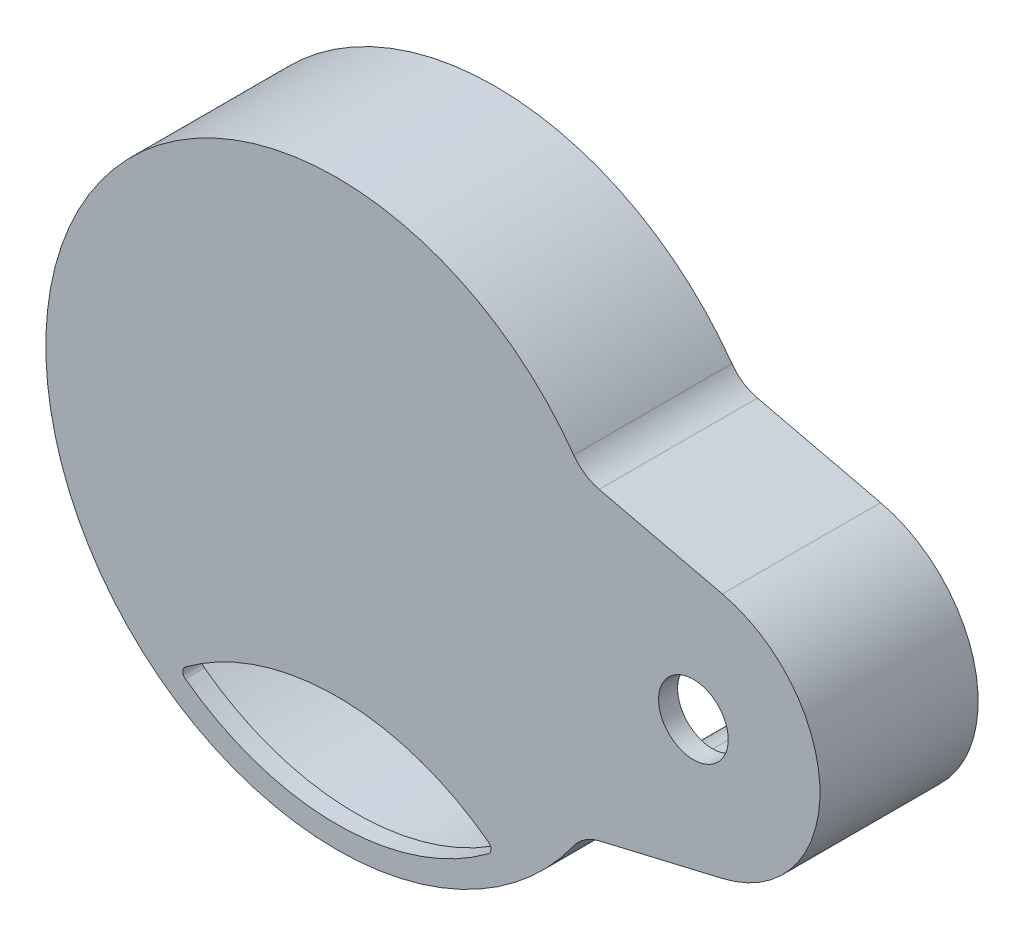
ISO-10303-21;
HEADER;
FILE_DESCRIPTION(('STEP AP214'),'2;1');
FILE_NAME('part.step','',(''),(''),'','','');
FILE_SCHEMA(('AUTOMOTIVE_DESIGN { 1 0 10303 214 1 1 1 1 }'));
ENDSEC;
DATA;
#1=APPLICATION_CONTEXT('core data for automotive mechanical design processes');
#2=APPLICATION_PROTOCOL_DEFINITION('international standard','automotive_design',2000,#1);
#3=PRODUCT_CONTEXT('',#1,'mechanical');
#4=PRODUCT('Part','Part','',(#3));
#5=PRODUCT_RELATED_PRODUCT_CATEGORY('part','',(#4));
#6=PRODUCT_DEFINITION_FORMATION('','',#4);
#7=PRODUCT_DEFINITION_CONTEXT('part definition',#1,'design');
#8=PRODUCT_DEFINITION('design','',#6,#7);
#9=PRODUCT_DEFINITION_SHAPE('','',#8);
#10=(LENGTH_UNIT() NAMED_UNIT(*) SI_UNIT(.MILLI.,.METRE.));
#11=(NAMED_UNIT(*) PLANE_ANGLE_UNIT() SI_UNIT($,.RADIAN.));
#12=(NAMED_UNIT(*) SI_UNIT($,.STERADIAN.) SOLID_ANGLE_UNIT());
#13=UNCERTAINTY_MEASURE_WITH_UNIT(LENGTH_MEASURE(1.E-05),#10,'distance_accuracy_value','');
#14=(GEOMETRIC_REPRESENTATION_CONTEXT(3) GLOBAL_UNCERTAINTY_ASSIGNED_CONTEXT((#13)) GLOBAL_UNIT_ASSIGNED_CONTEXT((#10,
#11,#12)) REPRESENTATION_CONTEXT('',''));
#15=CARTESIAN_POINT('',(0.,0.,0.));
#16=DIRECTION('',(0.,0.,1.));
#17=DIRECTION('',(1.,0.,0.));
#18=AXIS2_PLACEMENT_3D('',#15,#16,#17);
#19=CARTESIAN_POINT('',(43.0203044332523,30.7413410321939,25.));
#20=DIRECTION('',(0.,0.,-1.));
#21=DIRECTION('',(-1.,0.,0.));
#22=AXIS2_PLACEMENT_3D('',#19,#20,#21);
#23=CYLINDRICAL_SURFACE('',#22,9.87510417944691);
#24=DIRECTION('',(0.,0.,-1.));
#25=VECTOR('',#24,1.);
#26=CARTESIAN_POINT('',(40.7586135093194,21.1287224129244,25.));
#27=LINE('',#26,#25);
#28=CARTESIAN_POINT('',(40.7586135093194,21.1287224129244,22.));
#29=VERTEX_POINT('',#28);
#30=CARTESIAN_POINT('',(40.7586135093194,21.1287224129244,0.));
#31=VERTEX_POINT('',#30);
#32=EDGE_CURVE('E253',#29,#31,#27,.T.);
#33=ORIENTED_EDGE('',*,*,#32,.F.);
#34=CARTESIAN_POINT('',(43.0203044332523,30.7413410321939,22.));
#35=DIRECTION('',(0.,0.,1.));
#36=DIRECTION('',(1.,0.,0.));
#37=AXIS2_PLACEMENT_3D('',#34,#35,#36);
#38=CIRCLE('',#37,9.87510417944691);
#39=CARTESIAN_POINT('',(34.9857116171821,24.9999996527874,22.));
#40=VERTEX_POINT('',#39);
#41=EDGE_CURVE('E225',#29,#40,#38,.F.);
#42=ORIENTED_EDGE('',*,*,#41,.T.);
#43=DIRECTION('',(0.,0.,-1.));
#44=VECTOR('',#43,1.);
#45=CARTESIAN_POINT('',(34.9857116171821,24.9999996527874,25.));
#46=LINE('',#45,#44);
#47=CARTESIAN_POINT('',(34.9857116171821,24.9999996527874,0.));
#48=VERTEX_POINT('',#47);
#49=EDGE_CURVE('E268',#40,#48,#46,.T.);
#50=ORIENTED_EDGE('',*,*,#49,.T.);
#51=CARTESIAN_POINT('',(43.0203044332523,30.7413410321939,0.));
#52=DIRECTION('',(0.,0.,-1.));
#53=DIRECTION('',(1.,0.,0.));
#54=AXIS2_PLACEMENT_3D('',#51,#52,#53);
#55=CIRCLE('',#54,9.87510417944691);
#56=EDGE_CURVE('E229',#31,#48,#55,.T.);
#57=ORIENTED_EDGE('',*,*,#56,.F.);
#58=EDGE_LOOP('',(#33,#42,#50,#57));
#59=FACE_BOUND('',#58,.T.);
#60=ADVANCED_FACE('F43',(#59),#23,.T.);
#61=CARTESIAN_POINT('',(0.,0.,25.));
#62=DIRECTION('',(0.,0.,-1.));
#63=DIRECTION('',(-1.,0.,0.));
#64=AXIS2_PLACEMENT_3D('',#61,#62,#63);
#65=CYLINDRICAL_SURFACE('',#64,43.);
#66=ORIENTED_EDGE('',*,*,#49,.F.);
#67=CARTESIAN_POINT('',(0.,0.,22.));
#68=DIRECTION('',(0.,0.,1.));
#69=DIRECTION('',(1.,0.,0.));
#70=AXIS2_PLACEMENT_3D('',#67,#68,#69);
#71=CIRCLE('',#70,43.);
#72=CARTESIAN_POINT('',(34.9857111209615,-25.0000003472127,22.));
#73=VERTEX_POINT('',#72);
#74=EDGE_CURVE('E221',#40,#73,#71,.T.);
#75=ORIENTED_EDGE('',*,*,#74,.T.);
#76=DIRECTION('',(0.,0.,-1.));
#77=VECTOR('',#76,1.);
#78=CARTESIAN_POINT('',(34.9857111209615,-25.0000003472127,25.));
#79=LINE('',#78,#77);
#80=CARTESIAN_POINT('',(34.9857111209615,-25.0000003472127,0.));
#81=VERTEX_POINT('',#80);
#82=EDGE_CURVE('E265',#73,#81,#79,.T.);
#83=ORIENTED_EDGE('',*,*,#82,.T.);
#84=CARTESIAN_POINT('',(0.,0.,0.));
#85=DIRECTION('',(0.,0.,1.));
#86=DIRECTION('',(1.,0.,0.));
#87=AXIS2_PLACEMENT_3D('',#84,#85,#86);
#88=CIRCLE('',#87,43.);
#89=EDGE_CURVE('E233',#48,#81,#88,.T.);
#90=ORIENTED_EDGE('',*,*,#89,.F.);
#91=EDGE_LOOP('',(#66,#75,#83,#90));
#92=FACE_BOUND('',#91,.T.);
#93=ADVANCED_FACE('F378',(#92),#65,.F.);
#94=CARTESIAN_POINT('',(43.0203044332523,-30.7413410321939,25.));
#95=DIRECTION('',(0.,0.,-1.));
#96=DIRECTION('',(-1.,0.,0.));
#97=AXIS2_PLACEMENT_3D('',#94,#95,#96);
#98=CYLINDRICAL_SURFACE('',#97,9.87510417944684);
#99=ORIENTED_EDGE('',*,*,#82,.F.);
#100=CARTESIAN_POINT('',(43.0203044332523,-30.7413410321939,22.));
#101=DIRECTION('',(0.,0.,1.));
#102=DIRECTION('',(1.,0.,0.));
#103=AXIS2_PLACEMENT_3D('',#100,#101,#102);
#104=CIRCLE('',#103,9.87510417944684);
#105=CARTESIAN_POINT('',(40.7586135093194,-21.1287224129244,22.));
#106=VERTEX_POINT('',#105);
#107=EDGE_CURVE('E217',#73,#106,#104,.F.);
#108=ORIENTED_EDGE('',*,*,#107,.T.);
#109=DIRECTION('',(0.,0.,-1.));
#110=VECTOR('',#109,1.);
#111=CARTESIAN_POINT('',(40.7586135093194,-21.1287224129244,25.));
#112=LINE('',#111,#110);
#113=CARTESIAN_POINT('',(40.7586135093194,-21.1287224129244,0.));
#114=VERTEX_POINT('',#113);
#115=EDGE_CURVE('E262',#106,#114,#112,.T.);
#116=ORIENTED_EDGE('',*,*,#115,.T.);
#117=CARTESIAN_POINT('',(43.0203044332523,-30.7413410321939,0.));
#118=DIRECTION('',(0.,0.,-1.));
#119=DIRECTION('',(1.,0.,0.));
#120=AXIS2_PLACEMENT_3D('',#117,#118,#119);
#121=CIRCLE('',#120,9.87510417944684);
#122=EDGE_CURVE('E237',#81,#114,#121,.T.);
#123=ORIENTED_EDGE('',*,*,#122,.F.);
#124=EDGE_LOOP('',(#99,#108,#116,#123));
#125=FACE_BOUND('',#124,.T.);
#126=ADVANCED_FACE('F383',(#125),#98,.T.);
#127=CARTESIAN_POINT('',(60.2270027933056,-16.5481308913883,25.));
#128=DIRECTION('',(-0.229029576076803,0.973419464199314,0.));
#129=DIRECTION('',(-0.973419464199314,-0.229029576076803,0.));
#130=AXIS2_PLACEMENT_3D('',#127,#128,#129);
#131=PLANE('',#130);
#132=ORIENTED_EDGE('',*,*,#115,.F.);
#133=DIRECTION('',(0.973419464199314,0.229029576076803,0.));
#134=VECTOR('',#133,1.);
#135=CARTESIAN_POINT('',(60.2270027933056,-16.5481308913883,22.));
#136=LINE('',#135,#134);
#137=CARTESIAN_POINT('',(60.2270027933056,-16.5481308913883,22.));
#138=VERTEX_POINT('',#137);
#139=EDGE_CURVE('E213',#106,#138,#136,.T.);
#140=ORIENTED_EDGE('',*,*,#139,.T.);
#141=DIRECTION('',(0.,0.,-1.));
#142=VECTOR('',#141,1.);
#143=CARTESIAN_POINT('',(60.2270027933056,-16.5481308913883,25.));
#144=LINE('',#143,#142);
#145=CARTESIAN_POINT('',(60.2270027933056,-16.5481308913883,0.));
#146=VERTEX_POINT('',#145);
#147=EDGE_CURVE('E259',#138,#146,#144,.T.);
#148=ORIENTED_EDGE('',*,*,#147,.T.);
#149=DIRECTION('',(0.973419464199314,0.229029576076803,0.));
#150=VECTOR('',#149,1.);
#151=CARTESIAN_POINT('',(60.2270027933056,-16.5481308913883,0.));
#152=LINE('',#151,#150);
#153=EDGE_CURVE('E241',#114,#146,#152,.T.);
#154=ORIENTED_EDGE('',*,*,#153,.F.);
#155=EDGE_LOOP('',(#132,#140,#148,#154));
#156=FACE_BOUND('',#155,.T.);
#157=ADVANCED_FACE('F390',(#156),#131,.T.);
#158=CARTESIAN_POINT('',(56.3335,0.,25.));
#159=DIRECTION('',(0.,0.,-1.));
#160=DIRECTION('',(-1.,0.,0.));
#161=AXIS2_PLACEMENT_3D('',#158,#159,#160);
#162=CYLINDRICAL_SURFACE('',#161,17.);
#163=ORIENTED_EDGE('',*,*,#147,.F.);
#164=CARTESIAN_POINT('',(56.3335,0.,22.));
#165=DIRECTION('',(0.,0.,1.));
#166=DIRECTION('',(1.,0.,0.));
#167=AXIS2_PLACEMENT_3D('',#164,#165,#166);
#168=CIRCLE('',#167,17.);
#169=CARTESIAN_POINT('',(60.2270027933056,16.5481308913883,22.));
#170=VERTEX_POINT('',#169);
#171=EDGE_CURVE('E204',#138,#170,#168,.T.);
#172=ORIENTED_EDGE('',*,*,#171,.T.);
#173=DIRECTION('',(0.,0.,-1.));
#174=VECTOR('',#173,1.);
#175=CARTESIAN_POINT('',(60.2270027933056,16.5481308913883,25.));
#176=LINE('',#175,#174);
#177=CARTESIAN_POINT('',(60.2270027933056,16.5481308913883,0.));
#178=VERTEX_POINT('',#177);
#179=EDGE_CURVE('E256',#170,#178,#176,.T.);
#180=ORIENTED_EDGE('',*,*,#179,.T.);
#181=CARTESIAN_POINT('',(56.3335,0.,0.));
#182=DIRECTION('',(0.,0.,1.));
#183=DIRECTION('',(-1.,0.,0.));
#184=AXIS2_PLACEMENT_3D('',#181,#182,#183);
#185=CIRCLE('',#184,17.);
#186=EDGE_CURVE('E245',#146,#178,#185,.T.);
#187=ORIENTED_EDGE('',*,*,#186,.F.);
#188=EDGE_LOOP('',(#163,#172,#180,#187));
#189=FACE_BOUND('',#188,.T.);
#190=ADVANCED_FACE('F371',(#189),#162,.F.);
#191=CARTESIAN_POINT('',(40.7586135093194,21.1287224129244,25.));
#192=DIRECTION('',(-0.229029576076803,-0.973419464199314,0.));
#193=DIRECTION('',(0.973419464199314,-0.229029576076803,0.));
#194=AXIS2_PLACEMENT_3D('',#191,#192,#193);
#195=PLANE('',#194);
#196=ORIENTED_EDGE('',*,*,#179,.F.);
#197=DIRECTION('',(-0.973419464199314,0.229029576076803,0.));
#198=VECTOR('',#197,1.);
#199=CARTESIAN_POINT('',(40.7586135093194,21.1287224129244,22.));
#200=LINE('',#199,#198);
#201=EDGE_CURVE('E11',#170,#29,#200,.T.);
#202=ORIENTED_EDGE('',*,*,#201,.T.);
#203=ORIENTED_EDGE('',*,*,#32,.T.);
#204=DIRECTION('',(-0.973419464199314,0.229029576076803,0.));
#205=VECTOR('',#204,1.);
#206=CARTESIAN_POINT('',(40.7586135093194,21.1287224129244,0.));
#207=LINE('',#206,#205);
#208=EDGE_CURVE('E249',#178,#31,#207,.T.);
#209=ORIENTED_EDGE('',*,*,#208,.F.);
#210=EDGE_LOOP('',(#196,#202,#203,#209));
#211=FACE_BOUND('',#210,.T.);
#212=ADVANCED_FACE('F363',(#211),#195,.T.);
#213=CARTESIAN_POINT('',(43.0203044332523,-30.7413410321939,25.));
#214=DIRECTION('',(0.,0.,1.));
#215=DIRECTION('',(1.,0.,0.));
#216=AXIS2_PLACEMENT_3D('',#213,#214,#215);
#217=PLANE('',#216);
#218=CARTESIAN_POINT('',(56.3335,0.,25.));
#219=DIRECTION('',(0.,0.,1.));
#220=DIRECTION('',(1.,0.,0.));
#221=AXIS2_PLACEMENT_3D('',#218,#219,#220);
#222=CIRCLE('',#221,5.5);
#223=CARTESIAN_POINT('',(61.8335,0.,25.));
#224=VERTEX_POINT('',#223);
#225=EDGE_CURVE('E185',#224,#224,#222,.T.);
#226=ORIENTED_EDGE('',*,*,#225,.F.);
#227=EDGE_LOOP('',(#226));
#228=FACE_BOUND('',#227,.T.);
#229=CARTESIAN_POINT('',(0.,-2.52363009905265,25.));
#230=DIRECTION('',(0.,0.,1.));
#231=DIRECTION('',(-1.,0.,0.));
#232=AXIS2_PLACEMENT_3D('',#229,#230,#231);
#233=CIRCLE('',#232,40.);
#234=CARTESIAN_POINT('',(-23.9476923076923,-34.5627941508205,25.));
#235=VERTEX_POINT('',#234);
#236=CARTESIAN_POINT('',(23.9476923076923,-34.5627941508205,25.));
#237=VERTEX_POINT('',#236);
#238=EDGE_CURVE('E59',#235,#237,#233,.T.);
#239=ORIENTED_EDGE('',*,*,#238,.F.);
#240=CARTESIAN_POINT('',(-23.349,-33.7618150495263,25.));
#241=DIRECTION('',(0.,0.,1.));
#242=DIRECTION('',(-1.,0.,0.));
#243=AXIS2_PLACEMENT_3D('',#240,#241,#242);
#244=CIRCLE('',#243,0.999999999999999);
#245=CARTESIAN_POINT('',(-23.9476923076923,-32.9608359482321,25.));
#246=VERTEX_POINT('',#245);
#247=EDGE_CURVE('E178',#246,#235,#244,.T.);
#248=ORIENTED_EDGE('',*,*,#247,.F.);
#249=CARTESIAN_POINT('',(0.,-65.,25.));
#250=DIRECTION('',(0.,0.,1.));
#251=DIRECTION('',(-1.,0.,0.));
#252=AXIS2_PLACEMENT_3D('',#249,#250,#251);
#253=CIRCLE('',#252,40.);
#254=CARTESIAN_POINT('',(23.9476923076923,-32.9608359482321,25.));
#255=VERTEX_POINT('',#254);
#256=EDGE_CURVE('E182',#255,#246,#253,.T.);
#257=ORIENTED_EDGE('',*,*,#256,.F.);
#258=CARTESIAN_POINT('',(23.349,-33.7618150495263,25.));
#259=DIRECTION('',(0.,0.,1.));
#260=DIRECTION('',(-1.,0.,0.));
#261=AXIS2_PLACEMENT_3D('',#258,#259,#260);
#262=CIRCLE('',#261,0.999999999999999);
#263=EDGE_CURVE('E194',#237,#255,#262,.T.);
#264=ORIENTED_EDGE('',*,*,#263,.F.);
#265=EDGE_LOOP('',(#239,#248,#257,#264));
#266=FACE_BOUND('',#265,.T.);
#267=CARTESIAN_POINT('',(43.0203044332523,-30.7413410321939,25.));
#268=DIRECTION('',(0.,0.,-1.));
#269=DIRECTION('',(1.,0.,0.));
#270=AXIS2_PLACEMENT_3D('',#267,#268,#269);
#271=CIRCLE('',#270,6.87510417944683);
#272=CARTESIAN_POINT('',(37.4265744778301,-26.7441867114228,25.));
#273=VERTEX_POINT('',#272);
#274=CARTESIAN_POINT('',(41.4457022375498,-24.0489808055223,25.));
#275=VERTEX_POINT('',#274);
#276=EDGE_CURVE('E272',#273,#275,#271,.T.);
#277=ORIENTED_EDGE('',*,*,#276,.T.);
#278=DIRECTION('',(0.973419464199314,0.229029576076803,0.));
#279=VECTOR('',#278,1.);
#280=CARTESIAN_POINT('',(60.914091521536,-19.4683892839863,25.));
#281=LINE('',#280,#279);
#282=CARTESIAN_POINT('',(60.9140915215361,-19.4683892839863,25.));
#283=VERTEX_POINT('',#282);
#284=EDGE_CURVE('E276',#275,#283,#281,.T.);
#285=ORIENTED_EDGE('',*,*,#284,.T.);
#286=CARTESIAN_POINT('',(56.3335,0.,25.));
#287=DIRECTION('',(0.,0.,1.));
#288=DIRECTION('',(-1.,0.,0.));
#289=AXIS2_PLACEMENT_3D('',#286,#287,#288);
#290=CIRCLE('',#289,20.);
#291=CARTESIAN_POINT('',(60.9140915215361,19.4683892839863,25.));
#292=VERTEX_POINT('',#291);
#293=EDGE_CURVE('E280',#283,#292,#290,.T.);
#294=ORIENTED_EDGE('',*,*,#293,.T.);
#295=DIRECTION('',(-0.973419464199314,0.229029576076803,0.));
#296=VECTOR('',#295,1.);
#297=CARTESIAN_POINT('',(41.4457022375498,24.0489808055223,25.));
#298=LINE('',#297,#296);
#299=CARTESIAN_POINT('',(41.4457022375498,24.0489808055223,25.));
#300=VERTEX_POINT('',#299);
#301=EDGE_CURVE('E283',#292,#300,#298,.T.);
#302=ORIENTED_EDGE('',*,*,#301,.T.);
#303=CARTESIAN_POINT('',(43.0203044332523,30.7413410321939,25.));
#304=DIRECTION('',(0.,0.,-1.));
#305=DIRECTION('',(1.,0.,0.));
#306=AXIS2_PLACEMENT_3D('',#303,#304,#305);
#307=CIRCLE('',#306,6.8751041794468);
#308=CARTESIAN_POINT('',(37.4265748233019,26.7441862279598,25.));
#309=VERTEX_POINT('',#308);
#310=EDGE_CURVE('E286',#300,#309,#307,.T.);
#311=ORIENTED_EDGE('',*,*,#310,.T.);
#312=CARTESIAN_POINT('',(0.,0.,25.));
#313=DIRECTION('',(0.,0.,1.));
#314=DIRECTION('',(1.,0.,0.));
#315=AXIS2_PLACEMENT_3D('',#312,#313,#314);
#316=CIRCLE('',#315,46.0000000000001);
#317=EDGE_CURVE('E289',#309,#273,#316,.T.);
#318=ORIENTED_EDGE('',*,*,#317,.T.);
#319=EDGE_LOOP('',(#277,#285,#294,#302,#311,#318));
#320=FACE_BOUND('',#319,.T.);
#321=ADVANCED_FACE('F361',(#228,#266,#320),#217,.T.);
#322=CARTESIAN_POINT('',(43.0203044332523,-30.7413410321939,0.));
#323=DIRECTION('',(0.,0.,1.));
#324=DIRECTION('',(1.,0.,0.));
#325=AXIS2_PLACEMENT_3D('',#322,#323,#324);
#326=PLANE('',#325);
#327=CARTESIAN_POINT('',(43.0203044332523,-30.7413410321939,0.));
#328=DIRECTION('',(0.,0.,-1.));
#329=DIRECTION('',(1.,0.,0.));
#330=AXIS2_PLACEMENT_3D('',#327,#328,#329);
#331=CIRCLE('',#330,6.87510417944683);
#332=CARTESIAN_POINT('',(37.4265744778301,-26.7441867114228,0.));
#333=VERTEX_POINT('',#332);
#334=CARTESIAN_POINT('',(41.4457022375498,-24.0489808055223,0.));
#335=VERTEX_POINT('',#334);
#336=EDGE_CURVE('E271',#333,#335,#331,.T.);
#337=ORIENTED_EDGE('',*,*,#336,.F.);
#338=CARTESIAN_POINT('',(0.,0.,0.));
#339=DIRECTION('',(0.,0.,1.));
#340=DIRECTION('',(1.,0.,0.));
#341=AXIS2_PLACEMENT_3D('',#338,#339,#340);
#342=CIRCLE('',#341,46.0000000000001);
#343=CARTESIAN_POINT('',(37.4265748233019,26.7441862279598,0.));
#344=VERTEX_POINT('',#343);
#345=EDGE_CURVE('E277',#344,#333,#342,.T.);
#346=ORIENTED_EDGE('',*,*,#345,.F.);
#347=CARTESIAN_POINT('',(43.0203044332523,30.7413410321939,0.));
#348=DIRECTION('',(0.,0.,-1.));
#349=DIRECTION('',(1.,0.,0.));
#350=AXIS2_PLACEMENT_3D('',#347,#348,#349);
#351=CIRCLE('',#350,6.8751041794468);
#352=CARTESIAN_POINT('',(41.4457022375498,24.0489808055223,0.));
#353=VERTEX_POINT('',#352);
#354=EDGE_CURVE('E308',#353,#344,#351,.T.);
#355=ORIENTED_EDGE('',*,*,#354,.F.);
#356=DIRECTION('',(-0.973419464199314,0.229029576076803,0.));
#357=VECTOR('',#356,1.);
#358=CARTESIAN_POINT('',(41.4457022375498,24.0489808055223,0.));
#359=LINE('',#358,#357);
#360=CARTESIAN_POINT('',(60.9140915215361,19.4683892839863,0.));
#361=VERTEX_POINT('',#360);
#362=EDGE_CURVE('E304',#361,#353,#359,.T.);
#363=ORIENTED_EDGE('',*,*,#362,.F.);
#364=CARTESIAN_POINT('',(56.3335,0.,0.));
#365=DIRECTION('',(0.,0.,1.));
#366=DIRECTION('',(-1.,0.,0.));
#367=AXIS2_PLACEMENT_3D('',#364,#365,#366);
#368=CIRCLE('',#367,20.);
#369=CARTESIAN_POINT('',(60.9140915215361,-19.4683892839863,0.));
#370=VERTEX_POINT('',#369);
#371=EDGE_CURVE('E300',#370,#361,#368,.T.);
#372=ORIENTED_EDGE('',*,*,#371,.F.);
#373=DIRECTION('',(0.973419464199314,0.229029576076803,0.));
#374=VECTOR('',#373,1.);
#375=CARTESIAN_POINT('',(60.914091521536,-19.4683892839863,0.));
#376=LINE('',#375,#374);
#377=EDGE_CURVE('E296',#335,#370,#376,.T.);
#378=ORIENTED_EDGE('',*,*,#377,.F.);
#379=EDGE_LOOP('',(#337,#346,#355,#363,#372,#378));
#380=FACE_BOUND('',#379,.T.);
#381=ORIENTED_EDGE('',*,*,#56,.T.);
#382=ORIENTED_EDGE('',*,*,#89,.T.);
#383=ORIENTED_EDGE('',*,*,#122,.T.);
#384=ORIENTED_EDGE('',*,*,#153,.T.);
#385=ORIENTED_EDGE('',*,*,#186,.T.);
#386=ORIENTED_EDGE('',*,*,#208,.T.);
#387=EDGE_LOOP('',(#381,#382,#383,#384,#385,#386));
#388=FACE_BOUND('',#387,.T.);
#389=ADVANCED_FACE('F339',(#380,#388),#326,.F.);
#390=CARTESIAN_POINT('',(43.0203044332523,-30.7413410321939,25.));
#391=DIRECTION('',(0.,0.,-1.));
#392=DIRECTION('',(-1.,0.,0.));
#393=AXIS2_PLACEMENT_3D('',#390,#391,#392);
#394=CYLINDRICAL_SURFACE('',#393,6.87510417944683);
#395=DIRECTION('',(0.,0.,-1.));
#396=VECTOR('',#395,1.);
#397=CARTESIAN_POINT('',(37.4265744778301,-26.7441867114228,25.));
#398=LINE('',#397,#396);
#399=EDGE_CURVE('E292',#273,#333,#398,.T.);
#400=ORIENTED_EDGE('',*,*,#399,.T.);
#401=ORIENTED_EDGE('',*,*,#336,.T.);
#402=DIRECTION('',(0.,0.,-1.));
#403=VECTOR('',#402,1.);
#404=CARTESIAN_POINT('',(41.4457022375498,-24.0489808055223,25.));
#405=LINE('',#404,#403);
#406=EDGE_CURVE('E52',#275,#335,#405,.T.);
#407=ORIENTED_EDGE('',*,*,#406,.F.);
#408=ORIENTED_EDGE('',*,*,#276,.F.);
#409=EDGE_LOOP('',(#400,#401,#407,#408));
#410=FACE_BOUND('',#409,.T.);
#411=ADVANCED_FACE('F45',(#410),#394,.F.);
#412=CARTESIAN_POINT('',(60.914091521536,-19.4683892839863,25.));
#413=DIRECTION('',(-0.229029576076803,0.973419464199314,0.));
#414=DIRECTION('',(-0.973419464199314,-0.229029576076803,0.));
#415=AXIS2_PLACEMENT_3D('',#412,#413,#414);
#416=PLANE('',#415);
#417=ORIENTED_EDGE('',*,*,#406,.T.);
#418=ORIENTED_EDGE('',*,*,#377,.T.);
#419=DIRECTION('',(0.,0.,-1.));
#420=VECTOR('',#419,1.);
#421=CARTESIAN_POINT('',(60.9140915215361,-19.4683892839863,25.));
#422=LINE('',#421,#420);
#423=EDGE_CURVE('E326',#283,#370,#422,.T.);
#424=ORIENTED_EDGE('',*,*,#423,.F.);
#425=ORIENTED_EDGE('',*,*,#284,.F.);
#426=EDGE_LOOP('',(#417,#418,#424,#425));
#427=FACE_BOUND('',#426,.T.);
#428=ADVANCED_FACE('F332',(#427),#416,.F.);
#429=CARTESIAN_POINT('',(56.3335,0.,25.));
#430=DIRECTION('',(0.,0.,-1.));
#431=DIRECTION('',(-1.,0.,0.));
#432=AXIS2_PLACEMENT_3D('',#429,#430,#431);
#433=CYLINDRICAL_SURFACE('',#432,20.);
#434=ORIENTED_EDGE('',*,*,#423,.T.);
#435=ORIENTED_EDGE('',*,*,#371,.T.);
#436=DIRECTION('',(0.,0.,-1.));
#437=VECTOR('',#436,1.);
#438=CARTESIAN_POINT('',(60.9140915215361,19.4683892839863,25.));
#439=LINE('',#438,#437);
#440=EDGE_CURVE('E323',#292,#361,#439,.T.);
#441=ORIENTED_EDGE('',*,*,#440,.F.);
#442=ORIENTED_EDGE('',*,*,#293,.F.);
#443=EDGE_LOOP('',(#434,#435,#441,#442));
#444=FACE_BOUND('',#443,.T.);
#445=ADVANCED_FACE('F359',(#444),#433,.T.);
#446=CARTESIAN_POINT('',(41.4457022375498,24.0489808055223,25.));
#447=DIRECTION('',(-0.229029576076803,-0.973419464199314,0.));
#448=DIRECTION('',(0.973419464199314,-0.229029576076803,0.));
#449=AXIS2_PLACEMENT_3D('',#446,#447,#448);
#450=PLANE('',#449);
#451=ORIENTED_EDGE('',*,*,#440,.T.);
#452=ORIENTED_EDGE('',*,*,#362,.T.);
#453=DIRECTION('',(0.,0.,-1.));
#454=VECTOR('',#453,1.);
#455=CARTESIAN_POINT('',(41.4457022375498,24.0489808055223,25.));
#456=LINE('',#455,#454);
#457=EDGE_CURVE('E320',#300,#353,#456,.T.);
#458=ORIENTED_EDGE('',*,*,#457,.F.);
#459=ORIENTED_EDGE('',*,*,#301,.F.);
#460=EDGE_LOOP('',(#451,#452,#458,#459));
#461=FACE_BOUND('',#460,.T.);
#462=ADVANCED_FACE('F355',(#461),#450,.F.);
#463=CARTESIAN_POINT('',(43.0203044332523,30.7413410321939,25.));
#464=DIRECTION('',(0.,0.,-1.));
#465=DIRECTION('',(-1.,0.,0.));
#466=AXIS2_PLACEMENT_3D('',#463,#464,#465);
#467=CYLINDRICAL_SURFACE('',#466,6.8751041794468);
#468=ORIENTED_EDGE('',*,*,#457,.T.);
#469=ORIENTED_EDGE('',*,*,#354,.T.);
#470=DIRECTION('',(0.,0.,-1.));
#471=VECTOR('',#470,1.);
#472=CARTESIAN_POINT('',(37.4265748233019,26.7441862279598,25.));
#473=LINE('',#472,#471);
#474=EDGE_CURVE('E317',#309,#344,#473,.T.);
#475=ORIENTED_EDGE('',*,*,#474,.F.);
#476=ORIENTED_EDGE('',*,*,#310,.F.);
#477=EDGE_LOOP('',(#468,#469,#475,#476));
#478=FACE_BOUND('',#477,.T.);
#479=ADVANCED_FACE('F350',(#478),#467,.F.);
#480=CARTESIAN_POINT('',(0.,0.,25.));
#481=DIRECTION('',(0.,0.,-1.));
#482=DIRECTION('',(-1.,0.,0.));
#483=AXIS2_PLACEMENT_3D('',#480,#481,#482);
#484=CYLINDRICAL_SURFACE('',#483,46.0000000000001);
#485=ORIENTED_EDGE('',*,*,#474,.T.);
#486=ORIENTED_EDGE('',*,*,#345,.T.);
#487=ORIENTED_EDGE('',*,*,#399,.F.);
#488=ORIENTED_EDGE('',*,*,#317,.F.);
#489=EDGE_LOOP('',(#485,#486,#487,#488));
#490=FACE_BOUND('',#489,.T.);
#491=ADVANCED_FACE('F346',(#490),#484,.T.);
#492=CARTESIAN_POINT('',(43.0203044332523,-30.7413410321939,22.));
#493=DIRECTION('',(0.,0.,1.));
#494=DIRECTION('',(1.,0.,0.));
#495=AXIS2_PLACEMENT_3D('',#492,#493,#494);
#496=PLANE('',#495);
#497=CARTESIAN_POINT('',(56.3335,0.,22.));
#498=DIRECTION('',(0.,0.,1.));
#499=DIRECTION('',(1.,0.,0.));
#500=AXIS2_PLACEMENT_3D('',#497,#498,#499);
#501=CIRCLE('',#500,5.5);
#502=CARTESIAN_POINT('',(61.8335,0.,22.));
#503=VERTEX_POINT('',#502);
#504=EDGE_CURVE('E195',#503,#503,#501,.T.);
#505=ORIENTED_EDGE('',*,*,#504,.T.);
#506=EDGE_LOOP('',(#505));
#507=FACE_BOUND('',#506,.T.);
#508=CARTESIAN_POINT('',(-23.349,-33.7618150495263,22.));
#509=DIRECTION('',(0.,0.,1.));
#510=DIRECTION('',(-1.,0.,0.));
#511=AXIS2_PLACEMENT_3D('',#508,#509,#510);
#512=CIRCLE('',#511,0.999999999999999);
#513=CARTESIAN_POINT('',(-23.9476923076923,-32.9608359482321,22.));
#514=VERTEX_POINT('',#513);
#515=CARTESIAN_POINT('',(-23.9476923076923,-34.5627941508205,22.));
#516=VERTEX_POINT('',#515);
#517=EDGE_CURVE('E166',#514,#516,#512,.T.);
#518=ORIENTED_EDGE('',*,*,#517,.T.);
#519=CARTESIAN_POINT('',(0.,-2.52363009905265,22.));
#520=DIRECTION('',(0.,0.,1.));
#521=DIRECTION('',(-1.,0.,0.));
#522=AXIS2_PLACEMENT_3D('',#519,#520,#521);
#523=CIRCLE('',#522,40.);
#524=CARTESIAN_POINT('',(23.9476923076923,-34.5627941508205,22.));
#525=VERTEX_POINT('',#524);
#526=EDGE_CURVE('E159',#516,#525,#523,.T.);
#527=ORIENTED_EDGE('',*,*,#526,.T.);
#528=CARTESIAN_POINT('',(23.349,-33.7618150495263,22.));
#529=DIRECTION('',(0.,0.,1.));
#530=DIRECTION('',(-1.,0.,0.));
#531=AXIS2_PLACEMENT_3D('',#528,#529,#530);
#532=CIRCLE('',#531,0.999999999999999);
#533=CARTESIAN_POINT('',(23.9476923076923,-32.9608359482321,22.));
#534=VERTEX_POINT('',#533);
#535=EDGE_CURVE('E169',#525,#534,#532,.T.);
#536=ORIENTED_EDGE('',*,*,#535,.T.);
#537=CARTESIAN_POINT('',(0.,-65.,22.));
#538=DIRECTION('',(0.,0.,1.));
#539=DIRECTION('',(-1.,0.,0.));
#540=AXIS2_PLACEMENT_3D('',#537,#538,#539);
#541=CIRCLE('',#540,40.);
#542=EDGE_CURVE('E67',#534,#514,#541,.T.);
#543=ORIENTED_EDGE('',*,*,#542,.T.);
#544=EDGE_LOOP('',(#518,#527,#536,#543));
#545=FACE_BOUND('',#544,.T.);
#546=ORIENTED_EDGE('',*,*,#41,.F.);
#547=ORIENTED_EDGE('',*,*,#201,.F.);
#548=ORIENTED_EDGE('',*,*,#171,.F.);
#549=ORIENTED_EDGE('',*,*,#139,.F.);
#550=ORIENTED_EDGE('',*,*,#107,.F.);
#551=ORIENTED_EDGE('',*,*,#74,.F.);
#552=EDGE_LOOP('',(#546,#547,#548,#549,#550,#551));
#553=FACE_BOUND('',#552,.T.);
#554=ADVANCED_FACE('F174',(#507,#545,#553),#496,.F.);
#555=CARTESIAN_POINT('',(0.,-2.52363009905265,22.));
#556=DIRECTION('',(0.,0.,1.));
#557=DIRECTION('',(1.,0.,0.));
#558=AXIS2_PLACEMENT_3D('',#555,#556,#557);
#559=CYLINDRICAL_SURFACE('',#558,40.);
#560=ORIENTED_EDGE('',*,*,#238,.T.);
#561=DIRECTION('',(0.,0.,1.));
#562=VECTOR('',#561,1.);
#563=CARTESIAN_POINT('',(23.9476923076923,-34.5627941508205,22.));
#564=LINE('',#563,#562);
#565=EDGE_CURVE('E155',#525,#237,#564,.T.);
#566=ORIENTED_EDGE('',*,*,#565,.F.);
#567=ORIENTED_EDGE('',*,*,#526,.F.);
#568=DIRECTION('',(0.,0.,1.));
#569=VECTOR('',#568,1.);
#570=CARTESIAN_POINT('',(-23.9476923076923,-34.5627941508205,22.));
#571=LINE('',#570,#569);
#572=EDGE_CURVE('E201',#516,#235,#571,.T.);
#573=ORIENTED_EDGE('',*,*,#572,.T.);
#574=EDGE_LOOP('',(#560,#566,#567,#573));
#575=FACE_BOUND('',#574,.T.);
#576=ADVANCED_FACE('F157',(#575),#559,.F.);
#577=CARTESIAN_POINT('',(-23.349,-33.7618150495263,22.));
#578=DIRECTION('',(0.,0.,1.));
#579=DIRECTION('',(1.,0.,0.));
#580=AXIS2_PLACEMENT_3D('',#577,#578,#579);
#581=CYLINDRICAL_SURFACE('',#580,0.999999999999999);
#582=ORIENTED_EDGE('',*,*,#247,.T.);
#583=ORIENTED_EDGE('',*,*,#572,.F.);
#584=ORIENTED_EDGE('',*,*,#517,.F.);
#585=DIRECTION('',(0.,0.,1.));
#586=VECTOR('',#585,1.);
#587=CARTESIAN_POINT('',(-23.9476923076923,-32.9608359482321,22.));
#588=LINE('',#587,#586);
#589=EDGE_CURVE('E205',#514,#246,#588,.T.);
#590=ORIENTED_EDGE('',*,*,#589,.T.);
#591=EDGE_LOOP('',(#582,#583,#584,#590));
#592=FACE_BOUND('',#591,.T.);
#593=ADVANCED_FACE('F403',(#592),#581,.F.);
#594=CARTESIAN_POINT('',(0.,-65.,22.));
#595=DIRECTION('',(0.,0.,1.));
#596=DIRECTION('',(1.,0.,0.));
#597=AXIS2_PLACEMENT_3D('',#594,#595,#596);
#598=CYLINDRICAL_SURFACE('',#597,40.);
#599=ORIENTED_EDGE('',*,*,#256,.T.);
#600=ORIENTED_EDGE('',*,*,#589,.F.);
#601=ORIENTED_EDGE('',*,*,#542,.F.);
#602=DIRECTION('',(0.,0.,1.));
#603=VECTOR('',#602,1.);
#604=CARTESIAN_POINT('',(23.9476923076923,-32.9608359482321,22.));
#605=LINE('',#604,#603);
#606=EDGE_CURVE('E165',#534,#255,#605,.T.);
#607=ORIENTED_EDGE('',*,*,#606,.T.);
#608=EDGE_LOOP('',(#599,#600,#601,#607));
#609=FACE_BOUND('',#608,.T.);
#610=ADVANCED_FACE('F407',(#609),#598,.F.);
#611=CARTESIAN_POINT('',(23.349,-33.7618150495263,22.));
#612=DIRECTION('',(0.,0.,1.));
#613=DIRECTION('',(1.,0.,0.));
#614=AXIS2_PLACEMENT_3D('',#611,#612,#613);
#615=CYLINDRICAL_SURFACE('',#614,0.999999999999999);
#616=ORIENTED_EDGE('',*,*,#263,.T.);
#617=ORIENTED_EDGE('',*,*,#606,.F.);
#618=ORIENTED_EDGE('',*,*,#535,.F.);
#619=ORIENTED_EDGE('',*,*,#565,.T.);
#620=EDGE_LOOP('',(#616,#617,#618,#619));
#621=FACE_BOUND('',#620,.T.);
#622=ADVANCED_FACE('F170',(#621),#615,.F.);
#623=CARTESIAN_POINT('',(56.3335,0.,22.));
#624=DIRECTION('',(0.,0.,1.));
#625=DIRECTION('',(1.,0.,0.));
#626=AXIS2_PLACEMENT_3D('',#623,#624,#625);
#627=CYLINDRICAL_SURFACE('',#626,5.5);
#628=ORIENTED_EDGE('',*,*,#504,.F.);
#629=EDGE_LOOP('',(#628));
#630=FACE_BOUND('',#629,.T.);
#631=ORIENTED_EDGE('',*,*,#225,.T.);
#632=EDGE_LOOP('',(#631));
#633=FACE_BOUND('',#632,.T.);
#634=ADVANCED_FACE('F406',(#630,#633),#627,.F.);
#635=CLOSED_SHELL('',(#60,#93,#126,#157,#190,#212,#321,#389,#411,#428,#445,#462,#479,#491,#554,
#576,#593,#610,#622,#634));
#636=MANIFOLD_SOLID_BREP('B2',#635);
#637=ADVANCED_BREP_SHAPE_REPRESENTATION('',(#18,#636),#14);
#638=SHAPE_DEFINITION_REPRESENTATION(#9,#637);
ENDSEC;
END-ISO-10303-21;
